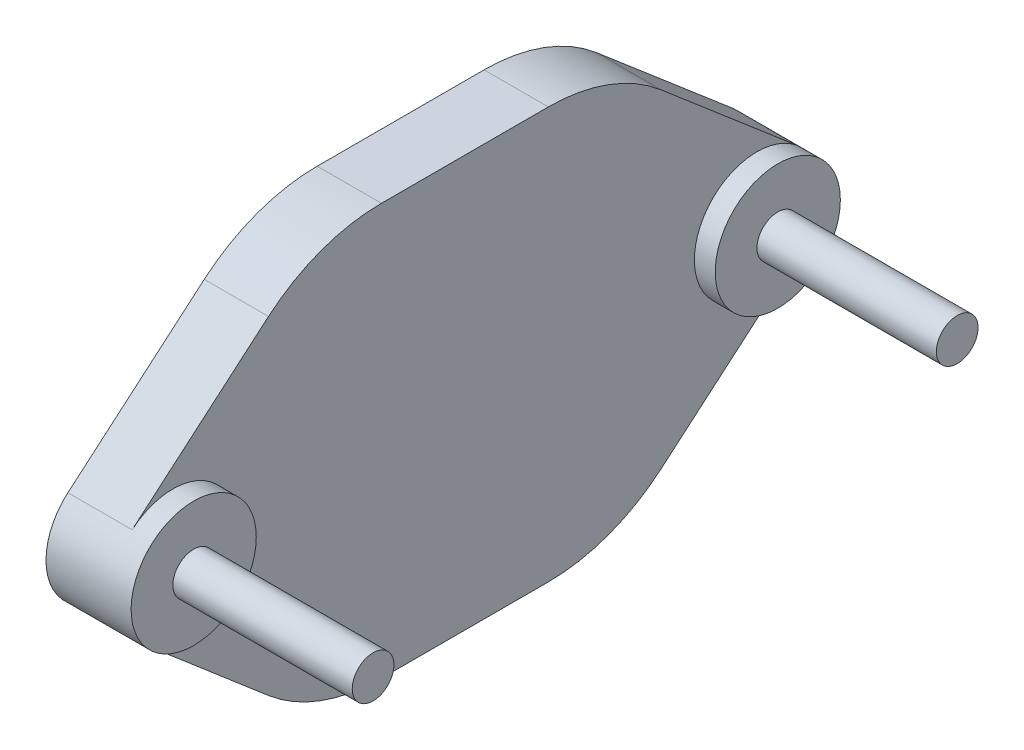
ISO-10303-21;
HEADER;
FILE_DESCRIPTION(('STEP AP214'),'2;1');
FILE_NAME('part.step','',(''),(''),'','','');
FILE_SCHEMA(('AUTOMOTIVE_DESIGN { 1 0 10303 214 1 1 1 1 }'));
ENDSEC;
DATA;
#1=APPLICATION_CONTEXT('core data for automotive mechanical design processes');
#2=APPLICATION_PROTOCOL_DEFINITION('international standard','automotive_design',2000,#1);
#3=PRODUCT_CONTEXT('',#1,'mechanical');
#4=PRODUCT('Part','Part','',(#3));
#5=PRODUCT_RELATED_PRODUCT_CATEGORY('part','',(#4));
#6=PRODUCT_DEFINITION_FORMATION('','',#4);
#7=PRODUCT_DEFINITION_CONTEXT('part definition',#1,'design');
#8=PRODUCT_DEFINITION('design','',#6,#7);
#9=PRODUCT_DEFINITION_SHAPE('','',#8);
#10=(LENGTH_UNIT() NAMED_UNIT(*) SI_UNIT(.MILLI.,.METRE.));
#11=(NAMED_UNIT(*) PLANE_ANGLE_UNIT() SI_UNIT($,.RADIAN.));
#12=(NAMED_UNIT(*) SI_UNIT($,.STERADIAN.) SOLID_ANGLE_UNIT());
#13=UNCERTAINTY_MEASURE_WITH_UNIT(LENGTH_MEASURE(1.E-05),#10,'distance_accuracy_value','');
#14=(GEOMETRIC_REPRESENTATION_CONTEXT(3) GLOBAL_UNCERTAINTY_ASSIGNED_CONTEXT((#13)) GLOBAL_UNIT_ASSIGNED_CONTEXT((#10,
#11,#12)) REPRESENTATION_CONTEXT('',''));
#15=CARTESIAN_POINT('',(0.,0.,0.));
#16=DIRECTION('',(0.,0.,1.));
#17=DIRECTION('',(1.,0.,0.));
#18=AXIS2_PLACEMENT_3D('',#15,#16,#17);
#19=CARTESIAN_POINT('',(19.558,0.,0.));
#20=DIRECTION('',(1.,0.,0.));
#21=DIRECTION('',(0.,0.,-1.));
#22=AXIS2_PLACEMENT_3D('',#19,#20,#21);
#23=PLANE('',#22);
#24=DIRECTION('',(0.,-0.64931100650113,0.760522989025637));
#25=VECTOR('',#24,1.);
#26=CARTESIAN_POINT('',(19.558,-58.3882068959576,-49.850045211628));
#27=LINE('',#26,#25);
#28=CARTESIAN_POINT('',(19.558,-14.4879737031369,-101.269374673846));
#29=VERTEX_POINT('',#28);
#30=CARTESIAN_POINT('',(19.558,-49.9468477681641,-59.7372142431561));
#31=VERTEX_POINT('',#30);
#32=EDGE_CURVE('E232',#29,#31,#27,.T.);
#33=ORIENTED_EDGE('',*,*,#32,.F.);
#34=CARTESIAN_POINT('',(19.558,-1.07621984650563E-05,-88.8999999999998));
#35=DIRECTION('',(1.,0.,0.));
#36=DIRECTION('',(0.,0.,-1.));
#37=AXIS2_PLACEMENT_3D('',#34,#35,#36);
#38=CIRCLE('',#37,19.0500000000001);
#39=CARTESIAN_POINT('',(19.558,14.4879482101719,-101.269379322137));
#40=VERTEX_POINT('',#39);
#41=EDGE_CURVE('E225',#40,#29,#38,.T.);
#42=ORIENTED_EDGE('',*,*,#41,.F.);
#43=DIRECTION('',(0.,0.649311250505885,0.760522780701856));
#44=VECTOR('',#43,1.);
#45=CARTESIAN_POINT('',(19.558,58.3881949498325,-49.8500674005709));
#46=LINE('',#45,#44);
#47=CARTESIAN_POINT('',(19.558,49.9468356002987,-59.7372302680082));
#48=VERTEX_POINT('',#47);
#49=EDGE_CURVE('E235',#40,#48,#46,.T.);
#50=ORIENTED_EDGE('',*,*,#49,.T.);
#51=CARTESIAN_POINT('',(19.558,9.72845678015649,-25.4));
#52=DIRECTION('',(1.,0.,0.));
#53=DIRECTION('',(0.,0.,-1.));
#54=AXIS2_PLACEMENT_3D('',#51,#52,#53);
#55=CIRCLE('',#54,52.8825432198438);
#56=CARTESIAN_POINT('',(19.558,62.611,-25.4));
#57=VERTEX_POINT('',#56);
#58=EDGE_CURVE('E237',#57,#48,#55,.F.);
#59=ORIENTED_EDGE('',*,*,#58,.F.);
#60=DIRECTION('',(0.,0.,-1.));
#61=VECTOR('',#60,1.);
#62=CARTESIAN_POINT('',(19.558,62.611,0.));
#63=LINE('',#62,#61);
#64=CARTESIAN_POINT('',(19.558,62.611,25.4));
#65=VERTEX_POINT('',#64);
#66=EDGE_CURVE('E240',#65,#57,#63,.T.);
#67=ORIENTED_EDGE('',*,*,#66,.F.);
#68=CARTESIAN_POINT('',(19.558,9.5445076787761,25.4));
#69=DIRECTION('',(1.,0.,0.));
#70=DIRECTION('',(0.,0.,-1.));
#71=AXIS2_PLACEMENT_3D('',#68,#69,#70);
#72=CIRCLE('',#71,53.0664923212239);
#73=CARTESIAN_POINT('',(19.558,49.9702989821736,59.7774345286653));
#74=VERTEX_POINT('',#73);
#75=EDGE_CURVE('E160',#65,#74,#72,.T.);
#76=ORIENTED_EDGE('',*,*,#75,.T.);
#77=DIRECTION('',(0.,0.649923072370877,-0.76));
#78=VECTOR('',#77,1.);
#79=CARTESIAN_POINT('',(19.558,58.389402461666,49.9323945286652));
#80=LINE('',#79,#78);
#81=CARTESIAN_POINT('',(19.558,14.478,101.281034528665));
#82=VERTEX_POINT('',#81);
#83=EDGE_CURVE('E141',#82,#74,#80,.T.);
#84=ORIENTED_EDGE('',*,*,#83,.F.);
#85=CARTESIAN_POINT('',(19.558,0.,88.9000000000001));
#86=DIRECTION('',(1.,0.,0.));
#87=DIRECTION('',(0.,0.,-1.));
#88=AXIS2_PLACEMENT_3D('',#85,#86,#87);
#89=CIRCLE('',#88,19.05);
#90=CARTESIAN_POINT('',(19.558,-14.478,101.281034528665));
#91=VERTEX_POINT('',#90);
#92=EDGE_CURVE('E134',#91,#82,#89,.T.);
#93=ORIENTED_EDGE('',*,*,#92,.F.);
#94=DIRECTION('',(0.,-0.649923072370877,-0.76));
#95=VECTOR('',#94,1.);
#96=CARTESIAN_POINT('',(19.558,-58.389402461666,49.9323945286652));
#97=LINE('',#96,#95);
#98=CARTESIAN_POINT('',(19.558,-49.9702989821736,59.7774345286652));
#99=VERTEX_POINT('',#98);
#100=EDGE_CURVE('E139',#91,#99,#97,.T.);
#101=ORIENTED_EDGE('',*,*,#100,.T.);
#102=CARTESIAN_POINT('',(19.558,-9.54450767877604,25.4));
#103=DIRECTION('',(1.,0.,0.));
#104=DIRECTION('',(0.,0.,-1.));
#105=AXIS2_PLACEMENT_3D('',#102,#103,#104);
#106=CIRCLE('',#105,53.0664923212239);
#107=CARTESIAN_POINT('',(19.558,-62.611,25.4));
#108=VERTEX_POINT('',#107);
#109=EDGE_CURVE('E157',#108,#99,#106,.F.);
#110=ORIENTED_EDGE('',*,*,#109,.F.);
#111=DIRECTION('',(0.,0.,-1.));
#112=VECTOR('',#111,1.);
#113=CARTESIAN_POINT('',(19.558,-62.611,0.));
#114=LINE('',#113,#112);
#115=CARTESIAN_POINT('',(19.558,-62.611,-25.4));
#116=VERTEX_POINT('',#115);
#117=EDGE_CURVE('E196',#108,#116,#114,.T.);
#118=ORIENTED_EDGE('',*,*,#117,.T.);
#119=CARTESIAN_POINT('',(19.558,-9.72846158719064,-25.4));
#120=DIRECTION('',(1.,0.,0.));
#121=DIRECTION('',(0.,0.,-1.));
#122=AXIS2_PLACEMENT_3D('',#119,#120,#121);
#123=CIRCLE('',#122,52.8825384128097);
#124=EDGE_CURVE('E110',#116,#31,#123,.T.);
#125=ORIENTED_EDGE('',*,*,#124,.T.);
#126=EDGE_LOOP('',(#33,#42,#50,#59,#67,#76,#84,#93,#101,#110,#118,#125));
#127=FACE_BOUND('',#126,.T.);
#128=ADVANCED_FACE('F39',(#127),#23,.T.);
#129=CARTESIAN_POINT('',(19.558,-62.611,0.));
#130=DIRECTION('',(0.,1.,0.));
#131=DIRECTION('',(0.,0.,1.));
#132=AXIS2_PLACEMENT_3D('',#129,#130,#131);
#133=PLANE('',#132);
#134=DIRECTION('',(0.,0.,-1.));
#135=VECTOR('',#134,1.);
#136=CARTESIAN_POINT('',(0.,-62.611,0.));
#137=LINE('',#136,#135);
#138=CARTESIAN_POINT('',(0.,-62.611,25.4));
#139=VERTEX_POINT('',#138);
#140=CARTESIAN_POINT('',(0.,-62.611,-25.4));
#141=VERTEX_POINT('',#140);
#142=EDGE_CURVE('E164',#139,#141,#137,.T.);
#143=ORIENTED_EDGE('',*,*,#142,.T.);
#144=DIRECTION('',(-1.,0.,0.));
#145=VECTOR('',#144,1.);
#146=CARTESIAN_POINT('',(19.558,-62.611,-25.4));
#147=LINE('',#146,#145);
#148=EDGE_CURVE('E11',#116,#141,#147,.T.);
#149=ORIENTED_EDGE('',*,*,#148,.F.);
#150=ORIENTED_EDGE('',*,*,#117,.F.);
#151=DIRECTION('',(-1.,0.,0.));
#152=VECTOR('',#151,1.);
#153=CARTESIAN_POINT('',(19.558,-62.611,25.4));
#154=LINE('',#153,#152);
#155=EDGE_CURVE('E58',#108,#139,#154,.T.);
#156=ORIENTED_EDGE('',*,*,#155,.T.);
#157=EDGE_LOOP('',(#143,#149,#150,#156));
#158=FACE_BOUND('',#157,.T.);
#159=ADVANCED_FACE('F41',(#158),#133,.F.);
#160=CARTESIAN_POINT('',(19.558,-9.72846158719064,-25.4));
#161=DIRECTION('',(-1.,0.,0.));
#162=DIRECTION('',(0.,0.,1.));
#163=AXIS2_PLACEMENT_3D('',#160,#161,#162);
#164=CYLINDRICAL_SURFACE('',#163,52.8825384128097);
#165=CARTESIAN_POINT('',(0.,-9.72846158719064,-25.4));
#166=DIRECTION('',(1.,0.,0.));
#167=DIRECTION('',(0.,0.,-1.));
#168=AXIS2_PLACEMENT_3D('',#165,#166,#167);
#169=CIRCLE('',#168,52.8825384128097);
#170=CARTESIAN_POINT('',(0.,-49.9468477681641,-59.7372142431561));
#171=VERTEX_POINT('',#170);
#172=EDGE_CURVE('E166',#141,#171,#169,.T.);
#173=ORIENTED_EDGE('',*,*,#172,.T.);
#174=DIRECTION('',(-1.,0.,0.));
#175=VECTOR('',#174,1.);
#176=CARTESIAN_POINT('',(19.558,-49.9468477681641,-59.7372142431561));
#177=LINE('',#176,#175);
#178=EDGE_CURVE('E49',#31,#171,#177,.T.);
#179=ORIENTED_EDGE('',*,*,#178,.F.);
#180=ORIENTED_EDGE('',*,*,#124,.F.);
#181=ORIENTED_EDGE('',*,*,#148,.T.);
#182=EDGE_LOOP('',(#173,#179,#180,#181));
#183=FACE_BOUND('',#182,.T.);
#184=ADVANCED_FACE('F270',(#183),#164,.T.);
#185=CARTESIAN_POINT('',(19.558,-58.3882068959576,-49.850045211628));
#186=DIRECTION('',(0.,-0.760522989025637,-0.64931100650113));
#187=DIRECTION('',(0.,0.64931100650113,-0.760522989025637));
#188=AXIS2_PLACEMENT_3D('',#185,#186,#187);
#189=PLANE('',#188);
#190=DIRECTION('',(0.,-0.64931100650113,0.760522989025637));
#191=VECTOR('',#190,1.);
#192=CARTESIAN_POINT('',(0.,-58.3882068959576,-49.850045211628));
#193=LINE('',#192,#191);
#194=CARTESIAN_POINT('',(0.,-14.4879737031369,-101.269374673846));
#195=VERTEX_POINT('',#194);
#196=EDGE_CURVE('E170',#195,#171,#193,.T.);
#197=ORIENTED_EDGE('',*,*,#196,.F.);
#198=DIRECTION('',(-1.,0.,0.));
#199=VECTOR('',#198,1.);
#200=CARTESIAN_POINT('',(19.558,-14.4879737031369,-101.269374673846));
#201=LINE('',#200,#199);
#202=EDGE_CURVE('E211',#29,#195,#201,.T.);
#203=ORIENTED_EDGE('',*,*,#202,.F.);
#204=ORIENTED_EDGE('',*,*,#32,.T.);
#205=ORIENTED_EDGE('',*,*,#178,.T.);
#206=EDGE_LOOP('',(#197,#203,#204,#205));
#207=FACE_BOUND('',#206,.T.);
#208=ADVANCED_FACE('F321',(#207),#189,.T.);
#209=CARTESIAN_POINT('',(19.558,-1.07621984650563E-05,-88.8999999999998));
#210=DIRECTION('',(-1.,0.,0.));
#211=DIRECTION('',(0.,0.,1.));
#212=AXIS2_PLACEMENT_3D('',#209,#210,#211);
#213=CYLINDRICAL_SURFACE('',#212,19.05);
#214=CARTESIAN_POINT('',(0.,-1.07621984650563E-05,-88.8999999999998));
#215=DIRECTION('',(1.,0.,0.));
#216=DIRECTION('',(0.,0.,-1.));
#217=AXIS2_PLACEMENT_3D('',#214,#215,#216);
#218=CIRCLE('',#217,19.05);
#219=CARTESIAN_POINT('',(0.,14.4879482101719,-101.269379322137));
#220=VERTEX_POINT('',#219);
#221=EDGE_CURVE('E173',#195,#220,#218,.T.);
#222=ORIENTED_EDGE('',*,*,#221,.T.);
#223=DIRECTION('',(-1.,0.,0.));
#224=VECTOR('',#223,1.);
#225=CARTESIAN_POINT('',(19.558,14.4879482101719,-101.269379322137));
#226=LINE('',#225,#224);
#227=EDGE_CURVE('E208',#40,#220,#226,.T.);
#228=ORIENTED_EDGE('',*,*,#227,.F.);
#229=ORIENTED_EDGE('',*,*,#41,.T.);
#230=ORIENTED_EDGE('',*,*,#202,.T.);
#231=EDGE_LOOP('',(#222,#228,#229,#230));
#232=FACE_BOUND('',#231,.T.);
#233=CARTESIAN_POINT('',(25.908,-1.07621984650563E-05,-88.8999999999998));
#234=DIRECTION('',(1.,0.,0.));
#235=DIRECTION('',(0.,0.,-1.));
#236=AXIS2_PLACEMENT_3D('',#233,#234,#235);
#237=CIRCLE('',#236,19.0500000000001);
#238=CARTESIAN_POINT('',(25.908,-1.07621984650563E-05,-107.95));
#239=VERTEX_POINT('',#238);
#240=EDGE_CURVE('E300',#239,#239,#237,.T.);
#241=ORIENTED_EDGE('',*,*,#240,.F.);
#242=EDGE_LOOP('',(#241));
#243=FACE_BOUND('',#242,.T.);
#244=ADVANCED_FACE('F306',(#232,#243),#213,.T.);
#245=CARTESIAN_POINT('',(19.558,58.3881949498325,-49.8500674005709));
#246=DIRECTION('',(0.,-0.760522780701856,0.649311250505885));
#247=DIRECTION('',(0.,-0.649311250505885,-0.760522780701856));
#248=AXIS2_PLACEMENT_3D('',#245,#246,#247);
#249=PLANE('',#248);
#250=DIRECTION('',(0.,0.649311250505885,0.760522780701856));
#251=VECTOR('',#250,1.);
#252=CARTESIAN_POINT('',(0.,58.3881949498325,-49.8500674005709));
#253=LINE('',#252,#251);
#254=CARTESIAN_POINT('',(0.,49.9468356002987,-59.7372302680082));
#255=VERTEX_POINT('',#254);
#256=EDGE_CURVE('E175',#220,#255,#253,.T.);
#257=ORIENTED_EDGE('',*,*,#256,.T.);
#258=DIRECTION('',(-1.,0.,0.));
#259=VECTOR('',#258,1.);
#260=CARTESIAN_POINT('',(19.558,49.9468356002987,-59.7372302680082));
#261=LINE('',#260,#259);
#262=EDGE_CURVE('E206',#48,#255,#261,.T.);
#263=ORIENTED_EDGE('',*,*,#262,.F.);
#264=ORIENTED_EDGE('',*,*,#49,.F.);
#265=ORIENTED_EDGE('',*,*,#227,.T.);
#266=EDGE_LOOP('',(#257,#263,#264,#265));
#267=FACE_BOUND('',#266,.T.);
#268=ADVANCED_FACE('F311',(#267),#249,.F.);
#269=CARTESIAN_POINT('',(19.558,9.72845678015649,-25.4));
#270=DIRECTION('',(-1.,0.,0.));
#271=DIRECTION('',(0.,0.,1.));
#272=AXIS2_PLACEMENT_3D('',#269,#270,#271);
#273=CYLINDRICAL_SURFACE('',#272,52.8825432198438);
#274=CARTESIAN_POINT('',(0.,9.72845678015649,-25.4));
#275=DIRECTION('',(1.,0.,0.));
#276=DIRECTION('',(0.,0.,-1.));
#277=AXIS2_PLACEMENT_3D('',#274,#275,#276);
#278=CIRCLE('',#277,52.8825432198438);
#279=CARTESIAN_POINT('',(0.,62.611,-25.4));
#280=VERTEX_POINT('',#279);
#281=EDGE_CURVE('E178',#280,#255,#278,.F.);
#282=ORIENTED_EDGE('',*,*,#281,.F.);
#283=DIRECTION('',(-1.,0.,0.));
#284=VECTOR('',#283,1.);
#285=CARTESIAN_POINT('',(19.558,62.611,-25.4));
#286=LINE('',#285,#284);
#287=EDGE_CURVE('E204',#57,#280,#286,.T.);
#288=ORIENTED_EDGE('',*,*,#287,.F.);
#289=ORIENTED_EDGE('',*,*,#58,.T.);
#290=ORIENTED_EDGE('',*,*,#262,.T.);
#291=EDGE_LOOP('',(#282,#288,#289,#290));
#292=FACE_BOUND('',#291,.T.);
#293=ADVANCED_FACE('F315',(#292),#273,.T.);
#294=CARTESIAN_POINT('',(19.558,62.611,0.));
#295=DIRECTION('',(0.,1.,0.));
#296=DIRECTION('',(0.,0.,1.));
#297=AXIS2_PLACEMENT_3D('',#294,#295,#296);
#298=PLANE('',#297);
#299=DIRECTION('',(0.,0.,-1.));
#300=VECTOR('',#299,1.);
#301=CARTESIAN_POINT('',(0.,62.611,0.));
#302=LINE('',#301,#300);
#303=CARTESIAN_POINT('',(0.,62.611,25.4));
#304=VERTEX_POINT('',#303);
#305=EDGE_CURVE('E181',#304,#280,#302,.T.);
#306=ORIENTED_EDGE('',*,*,#305,.F.);
#307=DIRECTION('',(-1.,0.,0.));
#308=VECTOR('',#307,1.);
#309=CARTESIAN_POINT('',(19.558,62.611,25.4));
#310=LINE('',#309,#308);
#311=EDGE_CURVE('E202',#65,#304,#310,.T.);
#312=ORIENTED_EDGE('',*,*,#311,.F.);
#313=ORIENTED_EDGE('',*,*,#66,.T.);
#314=ORIENTED_EDGE('',*,*,#287,.T.);
#315=EDGE_LOOP('',(#306,#312,#313,#314));
#316=FACE_BOUND('',#315,.T.);
#317=ADVANCED_FACE('F318',(#316),#298,.T.);
#318=CARTESIAN_POINT('',(19.558,9.5445076787761,25.4));
#319=DIRECTION('',(-1.,0.,0.));
#320=DIRECTION('',(0.,0.,1.));
#321=AXIS2_PLACEMENT_3D('',#318,#319,#320);
#322=CYLINDRICAL_SURFACE('',#321,53.0664923212239);
#323=CARTESIAN_POINT('',(0.,9.5445076787761,25.4));
#324=DIRECTION('',(1.,0.,0.));
#325=DIRECTION('',(0.,0.,-1.));
#326=AXIS2_PLACEMENT_3D('',#323,#324,#325);
#327=CIRCLE('',#326,53.0664923212239);
#328=CARTESIAN_POINT('',(0.,49.9702989821736,59.7774345286653));
#329=VERTEX_POINT('',#328);
#330=EDGE_CURVE('E184',#304,#329,#327,.T.);
#331=ORIENTED_EDGE('',*,*,#330,.T.);
#332=DIRECTION('',(-1.,0.,0.));
#333=VECTOR('',#332,1.);
#334=CARTESIAN_POINT('',(19.558,49.9702989821736,59.7774345286653));
#335=LINE('',#334,#333);
#336=EDGE_CURVE('E200',#74,#329,#335,.T.);
#337=ORIENTED_EDGE('',*,*,#336,.F.);
#338=ORIENTED_EDGE('',*,*,#75,.F.);
#339=ORIENTED_EDGE('',*,*,#311,.T.);
#340=EDGE_LOOP('',(#331,#337,#338,#339));
#341=FACE_BOUND('',#340,.T.);
#342=ADVANCED_FACE('F247',(#341),#322,.T.);
#343=CARTESIAN_POINT('',(19.558,58.389402461666,49.9323945286652));
#344=DIRECTION('',(0.,0.76,0.649923072370877));
#345=DIRECTION('',(0.,-0.649923072370877,0.76));
#346=AXIS2_PLACEMENT_3D('',#343,#344,#345);
#347=PLANE('',#346);
#348=DIRECTION('',(0.,0.649923072370877,-0.76));
#349=VECTOR('',#348,1.);
#350=CARTESIAN_POINT('',(0.,58.389402461666,49.9323945286652));
#351=LINE('',#350,#349);
#352=CARTESIAN_POINT('',(0.,14.478,101.281034528665));
#353=VERTEX_POINT('',#352);
#354=EDGE_CURVE('E187',#353,#329,#351,.T.);
#355=ORIENTED_EDGE('',*,*,#354,.F.);
#356=DIRECTION('',(-1.,0.,0.));
#357=VECTOR('',#356,1.);
#358=CARTESIAN_POINT('',(19.558,14.478,101.281034528665));
#359=LINE('',#358,#357);
#360=EDGE_CURVE('E154',#82,#353,#359,.T.);
#361=ORIENTED_EDGE('',*,*,#360,.F.);
#362=ORIENTED_EDGE('',*,*,#83,.T.);
#363=ORIENTED_EDGE('',*,*,#336,.T.);
#364=EDGE_LOOP('',(#355,#361,#362,#363));
#365=FACE_BOUND('',#364,.T.);
#366=ADVANCED_FACE('F251',(#365),#347,.T.);
#367=CARTESIAN_POINT('',(19.558,0.,88.9000000000001));
#368=DIRECTION('',(-1.,0.,0.));
#369=DIRECTION('',(0.,0.,1.));
#370=AXIS2_PLACEMENT_3D('',#367,#368,#369);
#371=CYLINDRICAL_SURFACE('',#370,19.05);
#372=CARTESIAN_POINT('',(0.,0.,88.9000000000001));
#373=DIRECTION('',(1.,0.,0.));
#374=DIRECTION('',(0.,0.,-1.));
#375=AXIS2_PLACEMENT_3D('',#372,#373,#374);
#376=CIRCLE('',#375,19.05);
#377=CARTESIAN_POINT('',(0.,-14.478,101.281034528665));
#378=VERTEX_POINT('',#377);
#379=EDGE_CURVE('E151',#353,#378,#376,.T.);
#380=ORIENTED_EDGE('',*,*,#379,.T.);
#381=DIRECTION('',(-1.,0.,0.));
#382=VECTOR('',#381,1.);
#383=CARTESIAN_POINT('',(19.558,-14.478,101.281034528665));
#384=LINE('',#383,#382);
#385=EDGE_CURVE('E147',#91,#378,#384,.T.);
#386=ORIENTED_EDGE('',*,*,#385,.F.);
#387=ORIENTED_EDGE('',*,*,#92,.T.);
#388=ORIENTED_EDGE('',*,*,#360,.T.);
#389=EDGE_LOOP('',(#380,#386,#387,#388));
#390=FACE_BOUND('',#389,.T.);
#391=CARTESIAN_POINT('',(25.908,0.,88.9000000000001));
#392=DIRECTION('',(1.,0.,0.));
#393=DIRECTION('',(0.,0.,-1.));
#394=AXIS2_PLACEMENT_3D('',#391,#392,#393);
#395=CIRCLE('',#394,19.05);
#396=CARTESIAN_POINT('',(25.908,0.,69.8500000000001));
#397=VERTEX_POINT('',#396);
#398=EDGE_CURVE('E144',#397,#397,#395,.T.);
#399=ORIENTED_EDGE('',*,*,#398,.F.);
#400=EDGE_LOOP('',(#399));
#401=FACE_BOUND('',#400,.T.);
#402=ADVANCED_FACE('F148',(#390,#401),#371,.T.);
#403=CARTESIAN_POINT('',(19.558,-58.389402461666,49.9323945286652));
#404=DIRECTION('',(0.,0.76,-0.649923072370877));
#405=DIRECTION('',(0.,0.649923072370877,0.76));
#406=AXIS2_PLACEMENT_3D('',#403,#404,#405);
#407=PLANE('',#406);
#408=DIRECTION('',(0.,-0.649923072370877,-0.76));
#409=VECTOR('',#408,1.);
#410=CARTESIAN_POINT('',(0.,-58.389402461666,49.9323945286652));
#411=LINE('',#410,#409);
#412=CARTESIAN_POINT('',(0.,-49.9702989821736,59.7774345286652));
#413=VERTEX_POINT('',#412);
#414=EDGE_CURVE('E191',#378,#413,#411,.T.);
#415=ORIENTED_EDGE('',*,*,#414,.T.);
#416=DIRECTION('',(-1.,0.,0.));
#417=VECTOR('',#416,1.);
#418=CARTESIAN_POINT('',(19.558,-49.9702989821736,59.7774345286652));
#419=LINE('',#418,#417);
#420=EDGE_CURVE('E98',#99,#413,#419,.T.);
#421=ORIENTED_EDGE('',*,*,#420,.F.);
#422=ORIENTED_EDGE('',*,*,#100,.F.);
#423=ORIENTED_EDGE('',*,*,#385,.T.);
#424=EDGE_LOOP('',(#415,#421,#422,#423));
#425=FACE_BOUND('',#424,.T.);
#426=ADVANCED_FACE('F156',(#425),#407,.F.);
#427=CARTESIAN_POINT('',(19.558,-9.54450767877604,25.4));
#428=DIRECTION('',(-1.,0.,0.));
#429=DIRECTION('',(0.,0.,1.));
#430=AXIS2_PLACEMENT_3D('',#427,#428,#429);
#431=CYLINDRICAL_SURFACE('',#430,53.0664923212239);
#432=CARTESIAN_POINT('',(0.,-9.54450767877604,25.4));
#433=DIRECTION('',(1.,0.,0.));
#434=DIRECTION('',(0.,0.,-1.));
#435=AXIS2_PLACEMENT_3D('',#432,#433,#434);
#436=CIRCLE('',#435,53.0664923212239);
#437=EDGE_CURVE('E193',#139,#413,#436,.F.);
#438=ORIENTED_EDGE('',*,*,#437,.F.);
#439=ORIENTED_EDGE('',*,*,#155,.F.);
#440=ORIENTED_EDGE('',*,*,#109,.T.);
#441=ORIENTED_EDGE('',*,*,#420,.T.);
#442=EDGE_LOOP('',(#438,#439,#440,#441));
#443=FACE_BOUND('',#442,.T.);
#444=ADVANCED_FACE('F255',(#443),#431,.T.);
#445=CARTESIAN_POINT('',(0.,0.,0.));
#446=DIRECTION('',(1.,0.,0.));
#447=DIRECTION('',(0.,0.,-1.));
#448=AXIS2_PLACEMENT_3D('',#445,#446,#447);
#449=PLANE('',#448);
#450=ORIENTED_EDGE('',*,*,#142,.F.);
#451=ORIENTED_EDGE('',*,*,#437,.T.);
#452=ORIENTED_EDGE('',*,*,#414,.F.);
#453=ORIENTED_EDGE('',*,*,#379,.F.);
#454=ORIENTED_EDGE('',*,*,#354,.T.);
#455=ORIENTED_EDGE('',*,*,#330,.F.);
#456=ORIENTED_EDGE('',*,*,#305,.T.);
#457=ORIENTED_EDGE('',*,*,#281,.T.);
#458=ORIENTED_EDGE('',*,*,#256,.F.);
#459=ORIENTED_EDGE('',*,*,#221,.F.);
#460=ORIENTED_EDGE('',*,*,#196,.T.);
#461=ORIENTED_EDGE('',*,*,#172,.F.);
#462=EDGE_LOOP('',(#450,#451,#452,#453,#454,#455,#456,#457,#458,#459,#460,#461));
#463=FACE_BOUND('',#462,.T.);
#464=ADVANCED_FACE('F254',(#463),#449,.F.);
#465=CARTESIAN_POINT('',(25.908,0.,88.9000000000001));
#466=DIRECTION('',(1.,0.,0.));
#467=DIRECTION('',(0.,0.,-1.));
#468=AXIS2_PLACEMENT_3D('',#465,#466,#467);
#469=PLANE('',#468);
#470=CARTESIAN_POINT('',(25.908,0.,88.9000000000001));
#471=DIRECTION('',(1.,0.,0.));
#472=DIRECTION('',(0.,0.,-1.));
#473=AXIS2_PLACEMENT_3D('',#470,#471,#472);
#474=CIRCLE('',#473,6.35);
#475=CARTESIAN_POINT('',(25.908,0.,95.2500000000001));
#476=VERTEX_POINT('',#475);
#477=EDGE_CURVE('E213',#476,#476,#474,.T.);
#478=ORIENTED_EDGE('',*,*,#477,.F.);
#479=EDGE_LOOP('',(#478));
#480=FACE_BOUND('',#479,.T.);
#481=ORIENTED_EDGE('',*,*,#398,.T.);
#482=EDGE_LOOP('',(#481));
#483=FACE_BOUND('',#482,.T.);
#484=ADVANCED_FACE('F262',(#480,#483),#469,.T.);
#485=CARTESIAN_POINT('',(80.518,0.,88.9000000000001));
#486=DIRECTION('',(1.,0.,0.));
#487=DIRECTION('',(0.,0.,-1.));
#488=AXIS2_PLACEMENT_3D('',#485,#486,#487);
#489=PLANE('',#488);
#490=CARTESIAN_POINT('',(80.518,0.,88.9000000000001));
#491=DIRECTION('',(1.,0.,0.));
#492=DIRECTION('',(0.,0.,-1.));
#493=AXIS2_PLACEMENT_3D('',#490,#491,#492);
#494=CIRCLE('',#493,6.35);
#495=CARTESIAN_POINT('',(80.518,0.,95.2500000000001));
#496=VERTEX_POINT('',#495);
#497=EDGE_CURVE('E167',#496,#496,#494,.T.);
#498=ORIENTED_EDGE('',*,*,#497,.T.);
#499=EDGE_LOOP('',(#498));
#500=FACE_BOUND('',#499,.T.);
#501=ADVANCED_FACE('F276',(#500),#489,.T.);
#502=CARTESIAN_POINT('',(80.518,0.,88.9000000000001));
#503=DIRECTION('',(-1.,0.,0.));
#504=DIRECTION('',(0.,0.,1.));
#505=AXIS2_PLACEMENT_3D('',#502,#503,#504);
#506=CYLINDRICAL_SURFACE('',#505,6.35);
#507=CARTESIAN_POINT('',(25.908,0.,95.2500000000001));
#508=CARTESIAN_POINT('',(26.4768541666667,0.,95.2500000000001));
#509=CARTESIAN_POINT('',(27.0457083333333,0.,95.2500000000001));
#510=CARTESIAN_POINT('',(28.1834166666667,0.,95.2500000000001));
#511=CARTESIAN_POINT('',(28.7522708333333,0.,95.2500000000001));
#512=CARTESIAN_POINT('',(29.8899791666667,0.,95.2500000000001));
#513=CARTESIAN_POINT('',(30.4588333333333,0.,95.2500000000001));
#514=CARTESIAN_POINT('',(31.5965416666667,0.,95.2500000000001));
#515=CARTESIAN_POINT('',(32.1653958333333,0.,95.2500000000001));
#516=CARTESIAN_POINT('',(33.3031041666667,0.,95.2500000000001));
#517=CARTESIAN_POINT('',(33.8719583333333,0.,95.2500000000001));
#518=CARTESIAN_POINT('',(35.0096666666667,0.,95.2500000000001));
#519=CARTESIAN_POINT('',(35.5785208333333,0.,95.2500000000001));
#520=CARTESIAN_POINT('',(36.7162291666667,0.,95.2500000000001));
#521=CARTESIAN_POINT('',(37.2850833333333,0.,95.2500000000001));
#522=CARTESIAN_POINT('',(38.4227916666667,0.,95.2500000000001));
#523=CARTESIAN_POINT('',(38.9916458333333,0.,95.2500000000001));
#524=CARTESIAN_POINT('',(40.1293541666667,0.,95.2500000000001));
#525=CARTESIAN_POINT('',(40.6982083333333,0.,95.2500000000001));
#526=CARTESIAN_POINT('',(41.8359166666667,0.,95.2500000000001));
#527=CARTESIAN_POINT('',(42.4047708333333,0.,95.2500000000001));
#528=CARTESIAN_POINT('',(43.5424791666667,0.,95.2500000000001));
#529=CARTESIAN_POINT('',(44.1113333333333,0.,95.2500000000001));
#530=CARTESIAN_POINT('',(45.2490416666667,0.,95.2500000000001));
#531=CARTESIAN_POINT('',(45.8178958333333,0.,95.2500000000001));
#532=CARTESIAN_POINT('',(46.9556041666667,0.,95.2500000000001));
#533=CARTESIAN_POINT('',(47.5244583333333,0.,95.2500000000001));
#534=CARTESIAN_POINT('',(48.6621666666667,0.,95.2500000000001));
#535=CARTESIAN_POINT('',(49.2310208333333,0.,95.2500000000001));
#536=CARTESIAN_POINT('',(50.3687291666667,0.,95.2500000000001));
#537=CARTESIAN_POINT('',(50.9375833333333,0.,95.2500000000001));
#538=CARTESIAN_POINT('',(52.0752916666667,0.,95.2500000000001));
#539=CARTESIAN_POINT('',(52.6441458333333,0.,95.2500000000001));
#540=CARTESIAN_POINT('',(53.7818541666667,0.,95.2500000000001));
#541=CARTESIAN_POINT('',(54.3507083333333,0.,95.2500000000001));
#542=CARTESIAN_POINT('',(55.4884166666667,0.,95.2500000000001));
#543=CARTESIAN_POINT('',(56.0572708333333,0.,95.2500000000001));
#544=CARTESIAN_POINT('',(57.1949791666667,0.,95.2500000000001));
#545=CARTESIAN_POINT('',(57.7638333333333,0.,95.2500000000001));
#546=CARTESIAN_POINT('',(58.9015416666667,0.,95.2500000000001));
#547=CARTESIAN_POINT('',(59.4703958333333,0.,95.2500000000001));
#548=CARTESIAN_POINT('',(60.6081041666667,0.,95.2500000000001));
#549=CARTESIAN_POINT('',(61.1769583333333,0.,95.2500000000001));
#550=CARTESIAN_POINT('',(62.3146666666667,0.,95.2500000000001));
#551=CARTESIAN_POINT('',(62.8835208333333,0.,95.2500000000001));
#552=CARTESIAN_POINT('',(64.0212291666667,0.,95.2500000000001));
#553=CARTESIAN_POINT('',(64.5900833333333,0.,95.2500000000001));
#554=CARTESIAN_POINT('',(65.7277916666667,0.,95.2500000000001));
#555=CARTESIAN_POINT('',(66.2966458333333,0.,95.2500000000001));
#556=CARTESIAN_POINT('',(67.4343541666667,0.,95.2500000000001));
#557=CARTESIAN_POINT('',(68.0032083333333,0.,95.2500000000001));
#558=CARTESIAN_POINT('',(69.1409166666667,0.,95.2500000000001));
#559=CARTESIAN_POINT('',(69.7097708333333,0.,95.2500000000001));
#560=CARTESIAN_POINT('',(70.8474791666667,0.,95.2500000000001));
#561=CARTESIAN_POINT('',(71.4163333333333,0.,95.2500000000001));
#562=CARTESIAN_POINT('',(72.5540416666666,0.,95.2500000000001));
#563=CARTESIAN_POINT('',(73.1228958333333,0.,95.2500000000001));
#564=CARTESIAN_POINT('',(74.2606041666667,0.,95.2500000000001));
#565=CARTESIAN_POINT('',(74.8294583333333,0.,95.2500000000001));
#566=CARTESIAN_POINT('',(75.9671666666667,0.,95.2500000000001));
#567=CARTESIAN_POINT('',(76.5360208333333,0.,95.2500000000001));
#568=CARTESIAN_POINT('',(77.6737291666666,0.,95.2500000000001));
#569=CARTESIAN_POINT('',(78.2425833333333,0.,95.2500000000001));
#570=CARTESIAN_POINT('',(79.3802916666667,0.,95.2500000000001));
#571=CARTESIAN_POINT('',(79.9491458333333,0.,95.2500000000001));
#572=CARTESIAN_POINT('',(80.518,0.,95.2500000000001));
#573=B_SPLINE_CURVE_WITH_KNOTS('',3,(#507,#508,#509,#510,#511,#512,#513,#514,#515,#516,#517,
#518,#519,#520,#521,#522,#523,#524,#525,#526,#527,#528,#529,#530,#531,#532,#533,#534,#535,#536,
#537,#538,#539,#540,#541,#542,#543,#544,#545,#546,#547,#548,#549,#550,#551,#552,#553,#554,#555,
#556,#557,#558,#559,#560,#561,#562,#563,#564,#565,#566,#567,#568,#569,#570,#571,#572),
.UNSPECIFIED.,.F.,.F.,(4,2,2,2,2,2,2,2,2,2,2,2,2,2,2,2,2,2,2,2,2,2,2,2,2,2,2,2,2,2,2,2,4),(0.,
1.7065625,3.413125,5.1196875,6.82625,8.5328125,10.239375,11.9459375,13.6525,15.3590625,
17.065625,18.7721875,20.47875,22.1853125,23.891875,25.5984375,27.305,29.0115625,30.718125,
32.4246875,34.13125,35.8378125,37.544375,39.2509375,40.9575,42.6640625,44.370625,46.0771875,
47.78375,49.4903125,51.196875,52.9034375,54.61),.UNSPECIFIED.);
#574=EDGE_CURVE('BSEAM272',#476,#496,#573,.T.);
#575=ORIENTED_EDGE('',*,*,#477,.T.);
#576=ORIENTED_EDGE('',*,*,#497,.F.);
#577=ORIENTED_EDGE('',*,*,#574,.T.);
#578=ORIENTED_EDGE('',*,*,#574,.F.);
#579=EDGE_LOOP('',(#575,#577,#576,#578));
#580=FACE_BOUND('',#579,.T.);
#581=ADVANCED_FACE('F272',(#580),#506,.T.);
#582=CARTESIAN_POINT('',(25.908,-1.07621984650563E-05,-88.8999999999998));
#583=DIRECTION('',(1.,0.,0.));
#584=DIRECTION('',(0.,0.,-1.));
#585=AXIS2_PLACEMENT_3D('',#582,#583,#584);
#586=PLANE('',#585);
#587=CARTESIAN_POINT('',(25.908,-1.07621984650563E-05,-88.8999999999998));
#588=DIRECTION('',(1.,0.,0.));
#589=DIRECTION('',(0.,0.,-1.));
#590=AXIS2_PLACEMENT_3D('',#587,#588,#589);
#591=CIRCLE('',#590,6.35);
#592=CARTESIAN_POINT('',(25.908,-1.07621984650563E-05,-82.5499999999999));
#593=VERTEX_POINT('',#592);
#594=EDGE_CURVE('E43',#593,#593,#591,.T.);
#595=ORIENTED_EDGE('',*,*,#594,.F.);
#596=EDGE_LOOP('',(#595));
#597=FACE_BOUND('',#596,.T.);
#598=ORIENTED_EDGE('',*,*,#240,.T.);
#599=EDGE_LOOP('',(#598));
#600=FACE_BOUND('',#599,.T.);
#601=ADVANCED_FACE('F275',(#597,#600),#586,.T.);
#602=CARTESIAN_POINT('',(80.518,-1.07621984650563E-05,-88.8999999999998));
#603=DIRECTION('',(1.,0.,0.));
#604=DIRECTION('',(0.,0.,-1.));
#605=AXIS2_PLACEMENT_3D('',#602,#603,#604);
#606=PLANE('',#605);
#607=CARTESIAN_POINT('',(80.518,-1.07621984650563E-05,-88.8999999999998));
#608=DIRECTION('',(1.,0.,0.));
#609=DIRECTION('',(0.,0.,-1.));
#610=AXIS2_PLACEMENT_3D('',#607,#608,#609);
#611=CIRCLE('',#610,6.35);
#612=CARTESIAN_POINT('',(80.518,-1.07621984650563E-05,-82.5499999999999));
#613=VERTEX_POINT('',#612);
#614=EDGE_CURVE('E215',#613,#613,#611,.T.);
#615=ORIENTED_EDGE('',*,*,#614,.T.);
#616=EDGE_LOOP('',(#615));
#617=FACE_BOUND('',#616,.T.);
#618=ADVANCED_FACE('F283',(#617),#606,.T.);
#619=CARTESIAN_POINT('',(80.518,-1.07621984650563E-05,-88.8999999999998));
#620=DIRECTION('',(-1.,0.,0.));
#621=DIRECTION('',(0.,0.,1.));
#622=AXIS2_PLACEMENT_3D('',#619,#620,#621);
#623=CYLINDRICAL_SURFACE('',#622,6.35);
#624=CARTESIAN_POINT('',(25.908,-1.07621984650563E-05,-82.5499999999999));
#625=CARTESIAN_POINT('',(26.4768541666667,-1.07621984650563E-05,-82.5499999999999));
#626=CARTESIAN_POINT('',(27.0457083333333,-1.07621984650563E-05,-82.5499999999999));
#627=CARTESIAN_POINT('',(28.1834166666667,-1.07621984650563E-05,-82.5499999999999));
#628=CARTESIAN_POINT('',(28.7522708333333,-1.07621984650563E-05,-82.5499999999999));
#629=CARTESIAN_POINT('',(29.8899791666667,-1.07621984650563E-05,-82.5499999999999));
#630=CARTESIAN_POINT('',(30.4588333333333,-1.07621984650563E-05,-82.5499999999999));
#631=CARTESIAN_POINT('',(31.5965416666667,-1.07621984650563E-05,-82.5499999999999));
#632=CARTESIAN_POINT('',(32.1653958333333,-1.07621984650563E-05,-82.5499999999999));
#633=CARTESIAN_POINT('',(33.3031041666667,-1.07621984650563E-05,-82.5499999999999));
#634=CARTESIAN_POINT('',(33.8719583333333,-1.07621984650563E-05,-82.5499999999999));
#635=CARTESIAN_POINT('',(35.0096666666667,-1.07621984650563E-05,-82.5499999999999));
#636=CARTESIAN_POINT('',(35.5785208333333,-1.07621984650563E-05,-82.5499999999999));
#637=CARTESIAN_POINT('',(36.7162291666667,-1.07621984650563E-05,-82.5499999999999));
#638=CARTESIAN_POINT('',(37.2850833333333,-1.07621984650563E-05,-82.5499999999999));
#639=CARTESIAN_POINT('',(38.4227916666667,-1.07621984650563E-05,-82.5499999999999));
#640=CARTESIAN_POINT('',(38.9916458333333,-1.07621984650563E-05,-82.5499999999999));
#641=CARTESIAN_POINT('',(40.1293541666667,-1.07621984650563E-05,-82.5499999999999));
#642=CARTESIAN_POINT('',(40.6982083333333,-1.07621984650563E-05,-82.5499999999999));
#643=CARTESIAN_POINT('',(41.8359166666667,-1.07621984650563E-05,-82.5499999999999));
#644=CARTESIAN_POINT('',(42.4047708333333,-1.07621984650563E-05,-82.5499999999999));
#645=CARTESIAN_POINT('',(43.5424791666667,-1.07621984650563E-05,-82.5499999999999));
#646=CARTESIAN_POINT('',(44.1113333333333,-1.07621984650563E-05,-82.5499999999999));
#647=CARTESIAN_POINT('',(45.2490416666667,-1.07621984650563E-05,-82.5499999999999));
#648=CARTESIAN_POINT('',(45.8178958333333,-1.07621984650563E-05,-82.5499999999999));
#649=CARTESIAN_POINT('',(46.9556041666667,-1.07621984650563E-05,-82.5499999999999));
#650=CARTESIAN_POINT('',(47.5244583333333,-1.07621984650563E-05,-82.5499999999999));
#651=CARTESIAN_POINT('',(48.6621666666667,-1.07621984650563E-05,-82.5499999999999));
#652=CARTESIAN_POINT('',(49.2310208333333,-1.07621984650563E-05,-82.5499999999999));
#653=CARTESIAN_POINT('',(50.3687291666667,-1.07621984650563E-05,-82.5499999999999));
#654=CARTESIAN_POINT('',(50.9375833333333,-1.07621984650563E-05,-82.5499999999999));
#655=CARTESIAN_POINT('',(52.0752916666667,-1.07621984650563E-05,-82.5499999999999));
#656=CARTESIAN_POINT('',(52.6441458333333,-1.07621984650563E-05,-82.5499999999999));
#657=CARTESIAN_POINT('',(53.7818541666667,-1.07621984650563E-05,-82.5499999999999));
#658=CARTESIAN_POINT('',(54.3507083333333,-1.07621984650563E-05,-82.5499999999999));
#659=CARTESIAN_POINT('',(55.4884166666667,-1.07621984650563E-05,-82.5499999999999));
#660=CARTESIAN_POINT('',(56.0572708333333,-1.07621984650563E-05,-82.5499999999999));
#661=CARTESIAN_POINT('',(57.1949791666667,-1.07621984650563E-05,-82.5499999999999));
#662=CARTESIAN_POINT('',(57.7638333333333,-1.07621984650563E-05,-82.5499999999999));
#663=CARTESIAN_POINT('',(58.9015416666667,-1.07621984650563E-05,-82.5499999999999));
#664=CARTESIAN_POINT('',(59.4703958333333,-1.07621984650563E-05,-82.5499999999999));
#665=CARTESIAN_POINT('',(60.6081041666667,-1.07621984650563E-05,-82.5499999999999));
#666=CARTESIAN_POINT('',(61.1769583333333,-1.07621984650563E-05,-82.5499999999999));
#667=CARTESIAN_POINT('',(62.3146666666667,-1.07621984650563E-05,-82.5499999999999));
#668=CARTESIAN_POINT('',(62.8835208333333,-1.07621984650563E-05,-82.5499999999999));
#669=CARTESIAN_POINT('',(64.0212291666667,-1.07621984650563E-05,-82.5499999999999));
#670=CARTESIAN_POINT('',(64.5900833333333,-1.07621984650563E-05,-82.5499999999999));
#671=CARTESIAN_POINT('',(65.7277916666667,-1.07621984650563E-05,-82.5499999999999));
#672=CARTESIAN_POINT('',(66.2966458333333,-1.07621984650563E-05,-82.5499999999999));
#673=CARTESIAN_POINT('',(67.4343541666667,-1.07621984650563E-05,-82.5499999999999));
#674=CARTESIAN_POINT('',(68.0032083333333,-1.07621984650563E-05,-82.5499999999999));
#675=CARTESIAN_POINT('',(69.1409166666667,-1.07621984650563E-05,-82.5499999999999));
#676=CARTESIAN_POINT('',(69.7097708333333,-1.07621984650563E-05,-82.5499999999999));
#677=CARTESIAN_POINT('',(70.8474791666667,-1.07621984650563E-05,-82.5499999999999));
#678=CARTESIAN_POINT('',(71.4163333333333,-1.07621984650563E-05,-82.5499999999999));
#679=CARTESIAN_POINT('',(72.5540416666666,-1.07621984650563E-05,-82.5499999999999));
#680=CARTESIAN_POINT('',(73.1228958333333,-1.07621984650563E-05,-82.5499999999999));
#681=CARTESIAN_POINT('',(74.2606041666667,-1.07621984650563E-05,-82.5499999999999));
#682=CARTESIAN_POINT('',(74.8294583333333,-1.07621984650563E-05,-82.5499999999999));
#683=CARTESIAN_POINT('',(75.9671666666667,-1.07621984650563E-05,-82.5499999999999));
#684=CARTESIAN_POINT('',(76.5360208333333,-1.07621984650563E-05,-82.5499999999999));
#685=CARTESIAN_POINT('',(77.6737291666666,-1.07621984650563E-05,-82.5499999999999));
#686=CARTESIAN_POINT('',(78.2425833333333,-1.07621984650563E-05,-82.5499999999999));
#687=CARTESIAN_POINT('',(79.3802916666667,-1.07621984650563E-05,-82.5499999999999));
#688=CARTESIAN_POINT('',(79.9491458333333,-1.07621984650563E-05,-82.5499999999999));
#689=CARTESIAN_POINT('',(80.518,-1.07621984650563E-05,-82.5499999999999));
#690=B_SPLINE_CURVE_WITH_KNOTS('',3,(#624,#625,#626,#627,#628,#629,#630,#631,#632,#633,#634,
#635,#636,#637,#638,#639,#640,#641,#642,#643,#644,#645,#646,#647,#648,#649,#650,#651,#652,#653,
#654,#655,#656,#657,#658,#659,#660,#661,#662,#663,#664,#665,#666,#667,#668,#669,#670,#671,#672,
#673,#674,#675,#676,#677,#678,#679,#680,#681,#682,#683,#684,#685,#686,#687,#688,#689),
.UNSPECIFIED.,.F.,.F.,(4,2,2,2,2,2,2,2,2,2,2,2,2,2,2,2,2,2,2,2,2,2,2,2,2,2,2,2,2,2,2,2,4),(0.,
1.7065625,3.413125,5.1196875,6.82625,8.5328125,10.239375,11.9459375,13.6525,15.3590625,
17.065625,18.7721875,20.47875,22.1853125,23.891875,25.5984375,27.305,29.0115625,30.718125,
32.4246875,34.13125,35.8378125,37.544375,39.2509375,40.9575,42.6640625,44.370625,46.0771875,
47.78375,49.4903125,51.196875,52.9034375,54.61),.UNSPECIFIED.);
#691=EDGE_CURVE('BSEAM280',#593,#613,#690,.T.);
#692=ORIENTED_EDGE('',*,*,#594,.T.);
#693=ORIENTED_EDGE('',*,*,#614,.F.);
#694=ORIENTED_EDGE('',*,*,#691,.T.);
#695=ORIENTED_EDGE('',*,*,#691,.F.);
#696=EDGE_LOOP('',(#692,#694,#693,#695));
#697=FACE_BOUND('',#696,.T.);
#698=ADVANCED_FACE('F280',(#697),#623,.T.);
#699=CLOSED_SHELL('',(#128,#159,#184,#208,#244,#268,#293,#317,#342,#366,#402,#426,#444,#464,
#484,#501,#581,#601,#618,#698));
#700=MANIFOLD_SOLID_BREP('B2',#699);
#701=ADVANCED_BREP_SHAPE_REPRESENTATION('',(#18,#700),#14);
#702=SHAPE_DEFINITION_REPRESENTATION(#9,#701);
ENDSEC;
END-ISO-10303-21;
